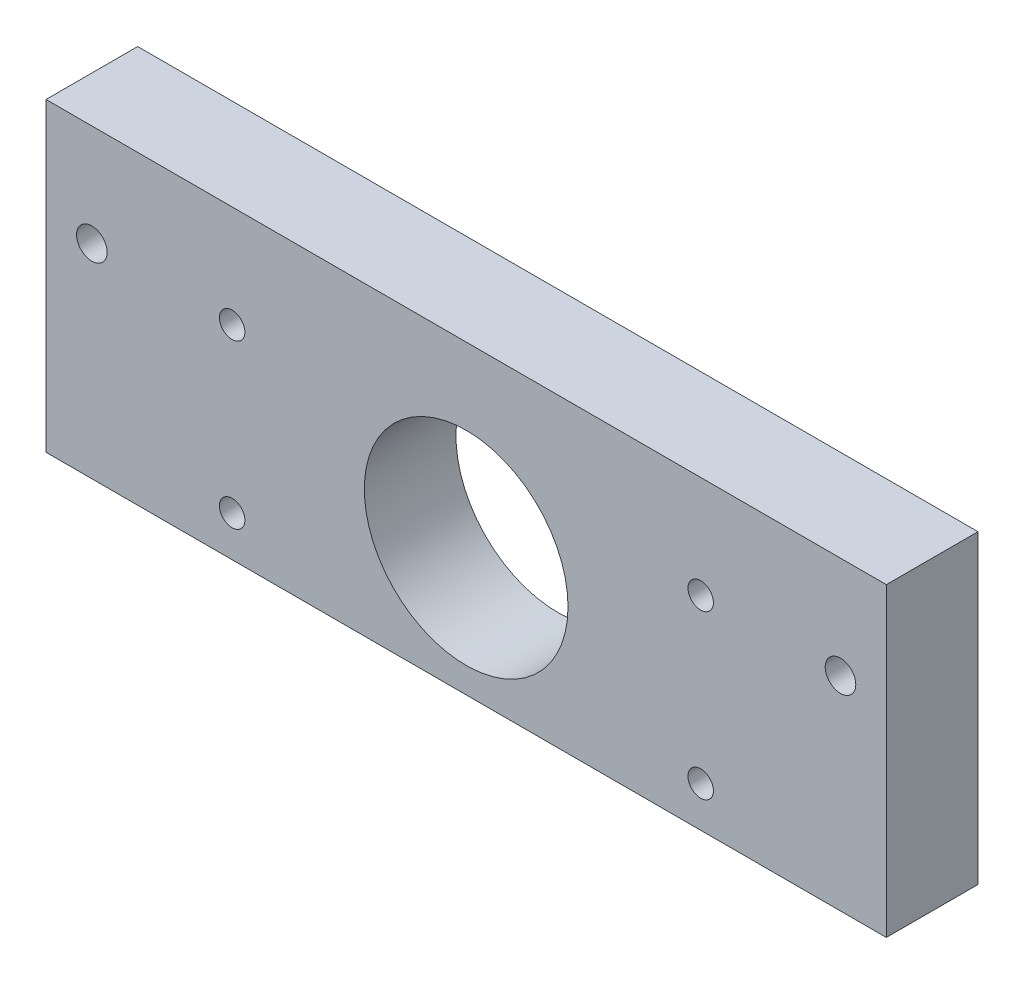
ISO-10303-21;
HEADER;
FILE_DESCRIPTION(('STEP AP214'),'2;1');
FILE_NAME('part.step','',(''),(''),'','','');
FILE_SCHEMA(('AUTOMOTIVE_DESIGN { 1 0 10303 214 1 1 1 1 }'));
ENDSEC;
DATA;
#1=APPLICATION_CONTEXT('core data for automotive mechanical design processes');
#2=APPLICATION_PROTOCOL_DEFINITION('international standard','automotive_design',2000,#1);
#3=PRODUCT_CONTEXT('',#1,'mechanical');
#4=PRODUCT('Part','Part','',(#3));
#5=PRODUCT_RELATED_PRODUCT_CATEGORY('part','',(#4));
#6=PRODUCT_DEFINITION_FORMATION('','',#4);
#7=PRODUCT_DEFINITION_CONTEXT('part definition',#1,'design');
#8=PRODUCT_DEFINITION('design','',#6,#7);
#9=PRODUCT_DEFINITION_SHAPE('','',#8);
#10=(LENGTH_UNIT() NAMED_UNIT(*) SI_UNIT(.MILLI.,.METRE.));
#11=(NAMED_UNIT(*) PLANE_ANGLE_UNIT() SI_UNIT($,.RADIAN.));
#12=(NAMED_UNIT(*) SI_UNIT($,.STERADIAN.) SOLID_ANGLE_UNIT());
#13=UNCERTAINTY_MEASURE_WITH_UNIT(LENGTH_MEASURE(1.E-05),#10,'distance_accuracy_value','');
#14=(GEOMETRIC_REPRESENTATION_CONTEXT(3) GLOBAL_UNCERTAINTY_ASSIGNED_CONTEXT((#13)) GLOBAL_UNIT_ASSIGNED_CONTEXT((#10,
#11,#12)) REPRESENTATION_CONTEXT('',''));
#15=CARTESIAN_POINT('',(0.,0.,0.));
#16=DIRECTION('',(0.,0.,1.));
#17=DIRECTION('',(1.,0.,0.));
#18=AXIS2_PLACEMENT_3D('',#15,#16,#17);
#19=CARTESIAN_POINT('',(82.5,30.,18.));
#20=DIRECTION('',(-1.,0.,0.));
#21=DIRECTION('',(0.,0.,1.));
#22=AXIS2_PLACEMENT_3D('',#19,#20,#21);
#23=PLANE('',#22);
#24=DIRECTION('',(0.,1.,0.));
#25=VECTOR('',#24,1.);
#26=CARTESIAN_POINT('',(82.5,30.,0.));
#27=LINE('',#26,#25);
#28=CARTESIAN_POINT('',(82.5,-30.,0.));
#29=VERTEX_POINT('',#28);
#30=CARTESIAN_POINT('',(82.5,30.,0.));
#31=VERTEX_POINT('',#30);
#32=EDGE_CURVE('E114',#29,#31,#27,.T.);
#33=ORIENTED_EDGE('',*,*,#32,.T.);
#34=DIRECTION('',(0.,0.,-1.));
#35=VECTOR('',#34,1.);
#36=CARTESIAN_POINT('',(82.5,30.,18.));
#37=LINE('',#36,#35);
#38=CARTESIAN_POINT('',(82.5,30.,18.));
#39=VERTEX_POINT('',#38);
#40=EDGE_CURVE('E11',#39,#31,#37,.T.);
#41=ORIENTED_EDGE('',*,*,#40,.F.);
#42=DIRECTION('',(0.,1.,0.));
#43=VECTOR('',#42,1.);
#44=CARTESIAN_POINT('',(82.5,30.,18.));
#45=LINE('',#44,#43);
#46=CARTESIAN_POINT('',(82.5,-30.,18.));
#47=VERTEX_POINT('',#46);
#48=EDGE_CURVE('E117',#47,#39,#45,.T.);
#49=ORIENTED_EDGE('',*,*,#48,.F.);
#50=DIRECTION('',(0.,0.,-1.));
#51=VECTOR('',#50,1.);
#52=CARTESIAN_POINT('',(82.5,-30.,18.));
#53=LINE('',#52,#51);
#54=EDGE_CURVE('E123',#47,#29,#53,.T.);
#55=ORIENTED_EDGE('',*,*,#54,.T.);
#56=EDGE_LOOP('',(#33,#41,#49,#55));
#57=FACE_BOUND('',#56,.T.);
#58=ADVANCED_FACE('F33',(#57),#23,.F.);
#59=CARTESIAN_POINT('',(-82.5,30.,18.));
#60=DIRECTION('',(0.,-1.,0.));
#61=DIRECTION('',(0.,0.,-1.));
#62=AXIS2_PLACEMENT_3D('',#59,#60,#61);
#63=PLANE('',#62);
#64=DIRECTION('',(-1.,0.,0.));
#65=VECTOR('',#64,1.);
#66=CARTESIAN_POINT('',(-82.5,30.,0.));
#67=LINE('',#66,#65);
#68=CARTESIAN_POINT('',(-82.5,30.,0.));
#69=VERTEX_POINT('',#68);
#70=EDGE_CURVE('E126',#31,#69,#67,.T.);
#71=ORIENTED_EDGE('',*,*,#70,.T.);
#72=DIRECTION('',(0.,0.,-1.));
#73=VECTOR('',#72,1.);
#74=CARTESIAN_POINT('',(-82.5,30.,18.));
#75=LINE('',#74,#73);
#76=CARTESIAN_POINT('',(-82.5,30.,18.));
#77=VERTEX_POINT('',#76);
#78=EDGE_CURVE('E41',#77,#69,#75,.T.);
#79=ORIENTED_EDGE('',*,*,#78,.F.);
#80=DIRECTION('',(-1.,0.,0.));
#81=VECTOR('',#80,1.);
#82=CARTESIAN_POINT('',(-82.5,30.,18.));
#83=LINE('',#82,#81);
#84=EDGE_CURVE('E80',#39,#77,#83,.T.);
#85=ORIENTED_EDGE('',*,*,#84,.F.);
#86=ORIENTED_EDGE('',*,*,#40,.T.);
#87=EDGE_LOOP('',(#71,#79,#85,#86));
#88=FACE_BOUND('',#87,.T.);
#89=ADVANCED_FACE('F151',(#88),#63,.F.);
#90=CARTESIAN_POINT('',(-82.5,30.,18.));
#91=DIRECTION('',(1.,0.,0.));
#92=DIRECTION('',(0.,1.,0.));
#93=AXIS2_PLACEMENT_3D('',#90,#91,#92);
#94=PLANE('',#93);
#95=DIRECTION('',(0.,-1.,0.));
#96=VECTOR('',#95,1.);
#97=CARTESIAN_POINT('',(-82.5,30.,0.));
#98=LINE('',#97,#96);
#99=CARTESIAN_POINT('',(-82.5,-30.,0.));
#100=VERTEX_POINT('',#99);
#101=EDGE_CURVE('E67',#69,#100,#98,.T.);
#102=ORIENTED_EDGE('',*,*,#101,.T.);
#103=DIRECTION('',(0.,0.,-1.));
#104=VECTOR('',#103,1.);
#105=CARTESIAN_POINT('',(-82.5,-30.,18.));
#106=LINE('',#105,#104);
#107=CARTESIAN_POINT('',(-82.5,-30.,18.));
#108=VERTEX_POINT('',#107);
#109=EDGE_CURVE('E131',#108,#100,#106,.T.);
#110=ORIENTED_EDGE('',*,*,#109,.F.);
#111=DIRECTION('',(0.,-1.,0.));
#112=VECTOR('',#111,1.);
#113=CARTESIAN_POINT('',(-82.5,30.,18.));
#114=LINE('',#113,#112);
#115=EDGE_CURVE('E120',#77,#108,#114,.T.);
#116=ORIENTED_EDGE('',*,*,#115,.F.);
#117=ORIENTED_EDGE('',*,*,#78,.T.);
#118=EDGE_LOOP('',(#102,#110,#116,#117));
#119=FACE_BOUND('',#118,.T.);
#120=ADVANCED_FACE('F133',(#119),#94,.F.);
#121=CARTESIAN_POINT('',(-82.5,-30.,18.));
#122=DIRECTION('',(0.,1.,0.));
#123=DIRECTION('',(0.,0.,1.));
#124=AXIS2_PLACEMENT_3D('',#121,#122,#123);
#125=PLANE('',#124);
#126=CARTESIAN_POINT('',(-57.5,-30.,9.00000000000004));
#127=DIRECTION('',(0.,-1.,0.));
#128=DIRECTION('',(0.,0.,-1.));
#129=AXIS2_PLACEMENT_3D('',#126,#127,#128);
#130=CIRCLE('',#129,1.99999999999999);
#131=CARTESIAN_POINT('',(-57.5,-30.,7.00000000000004));
#132=VERTEX_POINT('',#131);
#133=EDGE_CURVE('E98',#132,#132,#130,.T.);
#134=ORIENTED_EDGE('',*,*,#133,.F.);
#135=EDGE_LOOP('',(#134));
#136=FACE_BOUND('',#135,.T.);
#137=CARTESIAN_POINT('',(57.5000000000001,-30.,9.00000000000004));
#138=DIRECTION('',(0.,-1.,0.));
#139=DIRECTION('',(0.,0.,-1.));
#140=AXIS2_PLACEMENT_3D('',#137,#138,#139);
#141=CIRCLE('',#140,1.99999999999999);
#142=CARTESIAN_POINT('',(57.5000000000001,-30.,7.00000000000004));
#143=VERTEX_POINT('',#142);
#144=EDGE_CURVE('E97',#143,#143,#141,.T.);
#145=ORIENTED_EDGE('',*,*,#144,.F.);
#146=EDGE_LOOP('',(#145));
#147=FACE_BOUND('',#146,.T.);
#148=DIRECTION('',(1.,0.,0.));
#149=VECTOR('',#148,1.);
#150=CARTESIAN_POINT('',(-82.5,-30.,0.));
#151=LINE('',#150,#149);
#152=EDGE_CURVE('E73',#100,#29,#151,.T.);
#153=ORIENTED_EDGE('',*,*,#152,.T.);
#154=ORIENTED_EDGE('',*,*,#54,.F.);
#155=DIRECTION('',(1.,0.,0.));
#156=VECTOR('',#155,1.);
#157=CARTESIAN_POINT('',(-82.5,-30.,18.));
#158=LINE('',#157,#156);
#159=EDGE_CURVE('E49',#108,#47,#158,.T.);
#160=ORIENTED_EDGE('',*,*,#159,.F.);
#161=ORIENTED_EDGE('',*,*,#109,.T.);
#162=EDGE_LOOP('',(#153,#154,#160,#161));
#163=FACE_BOUND('',#162,.T.);
#164=ADVANCED_FACE('F140',(#136,#147,#163),#125,.F.);
#165=CARTESIAN_POINT('',(0.,0.,18.));
#166=DIRECTION('',(0.,0.,1.));
#167=DIRECTION('',(1.,0.,0.));
#168=AXIS2_PLACEMENT_3D('',#165,#166,#167);
#169=PLANE('',#168);
#170=CARTESIAN_POINT('',(46.0500000000003,9.94999999999987,18.));
#171=DIRECTION('',(0.,0.,-1.));
#172=DIRECTION('',(-1.,0.,0.));
#173=AXIS2_PLACEMENT_3D('',#170,#171,#172);
#174=CIRCLE('',#173,2.5);
#175=CARTESIAN_POINT('',(43.5500000000003,9.94999999999987,18.));
#176=VERTEX_POINT('',#175);
#177=EDGE_CURVE('E314',#176,#176,#174,.T.);
#178=ORIENTED_EDGE('',*,*,#177,.T.);
#179=EDGE_LOOP('',(#178));
#180=FACE_BOUND('',#179,.T.);
#181=CARTESIAN_POINT('',(46.0500000000002,-22.0500000000001,18.));
#182=DIRECTION('',(0.,0.,-1.));
#183=DIRECTION('',(-1.,0.,0.));
#184=AXIS2_PLACEMENT_3D('',#181,#182,#183);
#185=CIRCLE('',#184,2.5);
#186=CARTESIAN_POINT('',(43.5500000000002,-22.0500000000001,18.));
#187=VERTEX_POINT('',#186);
#188=EDGE_CURVE('E324',#187,#187,#185,.T.);
#189=ORIENTED_EDGE('',*,*,#188,.T.);
#190=EDGE_LOOP('',(#189));
#191=FACE_BOUND('',#190,.T.);
#192=CARTESIAN_POINT('',(-45.9499999999996,9.94999999999998,18.));
#193=DIRECTION('',(0.,0.,-1.));
#194=DIRECTION('',(-1.,0.,0.));
#195=AXIS2_PLACEMENT_3D('',#192,#193,#194);
#196=CIRCLE('',#195,2.5);
#197=CARTESIAN_POINT('',(-48.4499999999996,9.94999999999998,18.));
#198=VERTEX_POINT('',#197);
#199=EDGE_CURVE('E330',#198,#198,#196,.T.);
#200=ORIENTED_EDGE('',*,*,#199,.T.);
#201=EDGE_LOOP('',(#200));
#202=FACE_BOUND('',#201,.T.);
#203=CARTESIAN_POINT('',(-45.9499999999996,-22.05,18.));
#204=DIRECTION('',(0.,0.,-1.));
#205=DIRECTION('',(-1.,0.,0.));
#206=AXIS2_PLACEMENT_3D('',#203,#204,#205);
#207=CIRCLE('',#206,2.5);
#208=CARTESIAN_POINT('',(-48.4499999999996,-22.05,18.));
#209=VERTEX_POINT('',#208);
#210=EDGE_CURVE('E336',#209,#209,#207,.T.);
#211=ORIENTED_EDGE('',*,*,#210,.T.);
#212=EDGE_LOOP('',(#211));
#213=FACE_BOUND('',#212,.T.);
#214=CARTESIAN_POINT('',(73.5,9.99999999999999,18.));
#215=DIRECTION('',(0.,0.,1.));
#216=DIRECTION('',(1.,0.,0.));
#217=AXIS2_PLACEMENT_3D('',#214,#215,#216);
#218=CIRCLE('',#217,3.);
#219=CARTESIAN_POINT('',(76.5,9.99999999999999,18.));
#220=VERTEX_POINT('',#219);
#221=EDGE_CURVE('E339',#220,#220,#218,.T.);
#222=ORIENTED_EDGE('',*,*,#221,.F.);
#223=EDGE_LOOP('',(#222));
#224=FACE_BOUND('',#223,.T.);
#225=CARTESIAN_POINT('',(-73.5,9.99999999999999,18.));
#226=DIRECTION('',(0.,0.,1.));
#227=DIRECTION('',(1.,0.,0.));
#228=AXIS2_PLACEMENT_3D('',#225,#226,#227);
#229=CIRCLE('',#228,3.);
#230=CARTESIAN_POINT('',(-70.5,9.99999999999999,18.));
#231=VERTEX_POINT('',#230);
#232=EDGE_CURVE('E345',#231,#231,#229,.T.);
#233=ORIENTED_EDGE('',*,*,#232,.F.);
#234=EDGE_LOOP('',(#233));
#235=FACE_BOUND('',#234,.T.);
#236=CARTESIAN_POINT('',(0.,-5.,18.));
#237=DIRECTION('',(0.,0.,1.));
#238=DIRECTION('',(1.,0.,0.));
#239=AXIS2_PLACEMENT_3D('',#236,#237,#238);
#240=CIRCLE('',#239,20.);
#241=CARTESIAN_POINT('',(20.,-5.,18.));
#242=VERTEX_POINT('',#241);
#243=EDGE_CURVE('E110',#242,#242,#240,.T.);
#244=ORIENTED_EDGE('',*,*,#243,.F.);
#245=EDGE_LOOP('',(#244));
#246=FACE_BOUND('',#245,.T.);
#247=ORIENTED_EDGE('',*,*,#48,.T.);
#248=ORIENTED_EDGE('',*,*,#84,.T.);
#249=ORIENTED_EDGE('',*,*,#115,.T.);
#250=ORIENTED_EDGE('',*,*,#159,.T.);
#251=EDGE_LOOP('',(#247,#248,#249,#250));
#252=FACE_BOUND('',#251,.T.);
#253=ADVANCED_FACE('F142',(#180,#191,#202,#213,#224,#235,#246,#252),#169,.T.);
#254=CARTESIAN_POINT('',(0.,0.,0.));
#255=DIRECTION('',(0.,0.,1.));
#256=DIRECTION('',(1.,0.,0.));
#257=AXIS2_PLACEMENT_3D('',#254,#255,#256);
#258=PLANE('',#257);
#259=CARTESIAN_POINT('',(46.0500000000003,9.94999999999987,0.));
#260=DIRECTION('',(0.,0.,-1.));
#261=DIRECTION('',(-1.,0.,0.));
#262=AXIS2_PLACEMENT_3D('',#259,#260,#261);
#263=CIRCLE('',#262,2.49999999999999);
#264=CARTESIAN_POINT('',(43.5500000000003,9.94999999999987,0.));
#265=VERTEX_POINT('',#264);
#266=EDGE_CURVE('E317',#265,#265,#263,.T.);
#267=ORIENTED_EDGE('',*,*,#266,.F.);
#268=EDGE_LOOP('',(#267));
#269=FACE_BOUND('',#268,.T.);
#270=CARTESIAN_POINT('',(46.0500000000002,-22.0500000000001,0.));
#271=DIRECTION('',(0.,0.,-1.));
#272=DIRECTION('',(-1.,0.,0.));
#273=AXIS2_PLACEMENT_3D('',#270,#271,#272);
#274=CIRCLE('',#273,2.49999999999999);
#275=CARTESIAN_POINT('',(43.5500000000002,-22.0500000000001,0.));
#276=VERTEX_POINT('',#275);
#277=EDGE_CURVE('E319',#276,#276,#274,.T.);
#278=ORIENTED_EDGE('',*,*,#277,.F.);
#279=EDGE_LOOP('',(#278));
#280=FACE_BOUND('',#279,.T.);
#281=CARTESIAN_POINT('',(-45.9499999999996,9.94999999999998,0.));
#282=DIRECTION('',(0.,0.,-1.));
#283=DIRECTION('',(-1.,0.,0.));
#284=AXIS2_PLACEMENT_3D('',#281,#282,#283);
#285=CIRCLE('',#284,2.49999999999999);
#286=CARTESIAN_POINT('',(-48.4499999999996,9.94999999999998,0.));
#287=VERTEX_POINT('',#286);
#288=EDGE_CURVE('E327',#287,#287,#285,.T.);
#289=ORIENTED_EDGE('',*,*,#288,.F.);
#290=EDGE_LOOP('',(#289));
#291=FACE_BOUND('',#290,.T.);
#292=CARTESIAN_POINT('',(-45.9499999999996,-22.05,0.));
#293=DIRECTION('',(0.,0.,-1.));
#294=DIRECTION('',(-1.,0.,0.));
#295=AXIS2_PLACEMENT_3D('',#292,#293,#294);
#296=CIRCLE('',#295,2.49999999999999);
#297=CARTESIAN_POINT('',(-48.4499999999996,-22.05,0.));
#298=VERTEX_POINT('',#297);
#299=EDGE_CURVE('E333',#298,#298,#296,.T.);
#300=ORIENTED_EDGE('',*,*,#299,.F.);
#301=EDGE_LOOP('',(#300));
#302=FACE_BOUND('',#301,.T.);
#303=CARTESIAN_POINT('',(0.,-5.,0.));
#304=DIRECTION('',(0.,0.,1.));
#305=DIRECTION('',(1.,0.,0.));
#306=AXIS2_PLACEMENT_3D('',#303,#304,#305);
#307=CIRCLE('',#306,20.);
#308=CARTESIAN_POINT('',(20.,-5.,0.));
#309=VERTEX_POINT('',#308);
#310=EDGE_CURVE('E111',#309,#309,#307,.T.);
#311=ORIENTED_EDGE('',*,*,#310,.T.);
#312=EDGE_LOOP('',(#311));
#313=FACE_BOUND('',#312,.T.);
#314=ORIENTED_EDGE('',*,*,#32,.F.);
#315=ORIENTED_EDGE('',*,*,#152,.F.);
#316=ORIENTED_EDGE('',*,*,#101,.F.);
#317=ORIENTED_EDGE('',*,*,#70,.F.);
#318=EDGE_LOOP('',(#314,#315,#316,#317));
#319=FACE_BOUND('',#318,.T.);
#320=ADVANCED_FACE('F136',(#269,#280,#291,#302,#313,#319),#258,.F.);
#321=CARTESIAN_POINT('',(0.,-5.,0.));
#322=DIRECTION('',(0.,0.,1.));
#323=DIRECTION('',(1.,0.,0.));
#324=AXIS2_PLACEMENT_3D('',#321,#322,#323);
#325=CYLINDRICAL_SURFACE('',#324,20.);
#326=ORIENTED_EDGE('',*,*,#310,.F.);
#327=EDGE_LOOP('',(#326));
#328=FACE_BOUND('',#327,.T.);
#329=ORIENTED_EDGE('',*,*,#243,.T.);
#330=EDGE_LOOP('',(#329));
#331=FACE_BOUND('',#330,.T.);
#332=ADVANCED_FACE('F172',(#328,#331),#325,.F.);
#333=CARTESIAN_POINT('',(57.5000000000001,0.,9.00000000000004));
#334=DIRECTION('',(0.,-1.,0.));
#335=DIRECTION('',(0.,0.,-1.));
#336=AXIS2_PLACEMENT_3D('',#333,#334,#335);
#337=CONICAL_SURFACE('',#336,1.99999999999999,1.02974425867665);
#338=CARTESIAN_POINT('',(57.5000000000001,1.20172123805512,9.00000000000004));
#339=VERTEX_POINT('',#338);
#340=VERTEX_LOOP('',#339);
#341=FACE_BOUND('',#340,.T.);
#342=CARTESIAN_POINT('',(57.5000000000001,0.,9.00000000000004));
#343=DIRECTION('',(0.,-1.,0.));
#344=DIRECTION('',(0.,0.,-1.));
#345=AXIS2_PLACEMENT_3D('',#342,#343,#344);
#346=CIRCLE('',#345,1.99999999999999);
#347=CARTESIAN_POINT('',(57.5000000000001,0.,7.00000000000005));
#348=VERTEX_POINT('',#347);
#349=EDGE_CURVE('E101',#348,#348,#346,.T.);
#350=ORIENTED_EDGE('',*,*,#349,.T.);
#351=EDGE_LOOP('',(#350));
#352=FACE_BOUND('',#351,.T.);
#353=ADVANCED_FACE('F176',(#341,#352),#337,.F.);
#354=CARTESIAN_POINT('',(57.5000000000001,-30.,9.00000000000004));
#355=DIRECTION('',(0.,-1.,0.));
#356=DIRECTION('',(0.,0.,-1.));
#357=AXIS2_PLACEMENT_3D('',#354,#355,#356);
#358=CYLINDRICAL_SURFACE('',#357,1.99999999999999);
#359=ORIENTED_EDGE('',*,*,#349,.F.);
#360=EDGE_LOOP('',(#359));
#361=FACE_BOUND('',#360,.T.);
#362=ORIENTED_EDGE('',*,*,#144,.T.);
#363=EDGE_LOOP('',(#362));
#364=FACE_BOUND('',#363,.T.);
#365=ADVANCED_FACE('F91',(#361,#364),#358,.F.);
#366=CARTESIAN_POINT('',(-57.5,0.,9.00000000000004));
#367=DIRECTION('',(0.,-1.,0.));
#368=DIRECTION('',(0.,0.,-1.));
#369=AXIS2_PLACEMENT_3D('',#366,#367,#368);
#370=CONICAL_SURFACE('',#369,1.99999999999999,1.02974425867665);
#371=CARTESIAN_POINT('',(-57.5,1.20172123805512,9.00000000000004));
#372=VERTEX_POINT('',#371);
#373=VERTEX_LOOP('',#372);
#374=FACE_BOUND('',#373,.T.);
#375=CARTESIAN_POINT('',(-57.5,0.,9.00000000000004));
#376=DIRECTION('',(0.,-1.,0.));
#377=DIRECTION('',(0.,0.,-1.));
#378=AXIS2_PLACEMENT_3D('',#375,#376,#377);
#379=CIRCLE('',#378,1.99999999999999);
#380=CARTESIAN_POINT('',(-57.5,0.,7.00000000000005));
#381=VERTEX_POINT('',#380);
#382=EDGE_CURVE('E95',#381,#381,#379,.T.);
#383=ORIENTED_EDGE('',*,*,#382,.T.);
#384=EDGE_LOOP('',(#383));
#385=FACE_BOUND('',#384,.T.);
#386=ADVANCED_FACE('F87',(#374,#385),#370,.F.);
#387=CARTESIAN_POINT('',(-57.5,-30.,9.00000000000004));
#388=DIRECTION('',(0.,-1.,0.));
#389=DIRECTION('',(0.,0.,-1.));
#390=AXIS2_PLACEMENT_3D('',#387,#388,#389);
#391=CYLINDRICAL_SURFACE('',#390,1.99999999999999);
#392=ORIENTED_EDGE('',*,*,#382,.F.);
#393=EDGE_LOOP('',(#392));
#394=FACE_BOUND('',#393,.T.);
#395=ORIENTED_EDGE('',*,*,#133,.T.);
#396=EDGE_LOOP('',(#395));
#397=FACE_BOUND('',#396,.T.);
#398=ADVANCED_FACE('F90',(#394,#397),#391,.F.);
#399=CARTESIAN_POINT('',(-73.5,9.99999999999999,4.));
#400=DIRECTION('',(0.,0.,-1.));
#401=DIRECTION('',(-1.,0.,0.));
#402=AXIS2_PLACEMENT_3D('',#399,#400,#401);
#403=PLANE('',#402);
#404=CARTESIAN_POINT('',(-73.5,9.99999999999999,4.));
#405=DIRECTION('',(0.,0.,1.));
#406=DIRECTION('',(1.,0.,0.));
#407=AXIS2_PLACEMENT_3D('',#404,#405,#406);
#408=CIRCLE('',#407,3.);
#409=CARTESIAN_POINT('',(-70.5,9.99999999999999,4.));
#410=VERTEX_POINT('',#409);
#411=EDGE_CURVE('E104',#410,#410,#408,.T.);
#412=ORIENTED_EDGE('',*,*,#411,.T.);
#413=EDGE_LOOP('',(#412));
#414=FACE_BOUND('',#413,.T.);
#415=ADVANCED_FACE('F217',(#414),#403,.F.);
#416=CARTESIAN_POINT('',(-73.5,9.99999999999999,18.));
#417=DIRECTION('',(0.,0.,1.));
#418=DIRECTION('',(1.,0.,0.));
#419=AXIS2_PLACEMENT_3D('',#416,#417,#418);
#420=CYLINDRICAL_SURFACE('',#419,3.);
#421=ORIENTED_EDGE('',*,*,#411,.F.);
#422=EDGE_LOOP('',(#421));
#423=FACE_BOUND('',#422,.T.);
#424=ORIENTED_EDGE('',*,*,#232,.T.);
#425=EDGE_LOOP('',(#424));
#426=FACE_BOUND('',#425,.T.);
#427=ADVANCED_FACE('F226',(#423,#426),#420,.F.);
#428=CARTESIAN_POINT('',(73.5,9.99999999999999,4.));
#429=DIRECTION('',(0.,0.,-1.));
#430=DIRECTION('',(-1.,0.,0.));
#431=AXIS2_PLACEMENT_3D('',#428,#429,#430);
#432=PLANE('',#431);
#433=CARTESIAN_POINT('',(73.5,9.99999999999999,4.));
#434=DIRECTION('',(0.,0.,1.));
#435=DIRECTION('',(1.,0.,0.));
#436=AXIS2_PLACEMENT_3D('',#433,#434,#435);
#437=CIRCLE('',#436,3.);
#438=CARTESIAN_POINT('',(76.5,9.99999999999999,4.));
#439=VERTEX_POINT('',#438);
#440=EDGE_CURVE('E342',#439,#439,#437,.T.);
#441=ORIENTED_EDGE('',*,*,#440,.T.);
#442=EDGE_LOOP('',(#441));
#443=FACE_BOUND('',#442,.T.);
#444=ADVANCED_FACE('F236',(#443),#432,.F.);
#445=CARTESIAN_POINT('',(73.5,9.99999999999999,18.));
#446=DIRECTION('',(0.,0.,1.));
#447=DIRECTION('',(1.,0.,0.));
#448=AXIS2_PLACEMENT_3D('',#445,#446,#447);
#449=CYLINDRICAL_SURFACE('',#448,3.);
#450=ORIENTED_EDGE('',*,*,#440,.F.);
#451=EDGE_LOOP('',(#450));
#452=FACE_BOUND('',#451,.T.);
#453=ORIENTED_EDGE('',*,*,#221,.T.);
#454=EDGE_LOOP('',(#453));
#455=FACE_BOUND('',#454,.T.);
#456=ADVANCED_FACE('F246',(#452,#455),#449,.F.);
#457=CARTESIAN_POINT('',(-45.9499999999996,-22.05,0.));
#458=DIRECTION('',(0.,0.,-1.));
#459=DIRECTION('',(-1.,0.,0.));
#460=AXIS2_PLACEMENT_3D('',#457,#458,#459);
#461=CYLINDRICAL_SURFACE('',#460,2.49999999999999);
#462=ORIENTED_EDGE('',*,*,#210,.F.);
#463=EDGE_LOOP('',(#462));
#464=FACE_BOUND('',#463,.T.);
#465=ORIENTED_EDGE('',*,*,#299,.T.);
#466=EDGE_LOOP('',(#465));
#467=FACE_BOUND('',#466,.T.);
#468=ADVANCED_FACE('F256',(#464,#467),#461,.F.);
#469=CARTESIAN_POINT('',(-45.9499999999996,9.94999999999998,0.));
#470=DIRECTION('',(0.,0.,-1.));
#471=DIRECTION('',(-1.,0.,0.));
#472=AXIS2_PLACEMENT_3D('',#469,#470,#471);
#473=CYLINDRICAL_SURFACE('',#472,2.49999999999999);
#474=ORIENTED_EDGE('',*,*,#199,.F.);
#475=EDGE_LOOP('',(#474));
#476=FACE_BOUND('',#475,.T.);
#477=ORIENTED_EDGE('',*,*,#288,.T.);
#478=EDGE_LOOP('',(#477));
#479=FACE_BOUND('',#478,.T.);
#480=ADVANCED_FACE('F277',(#476,#479),#473,.F.);
#481=CARTESIAN_POINT('',(46.0500000000002,-22.0500000000001,0.));
#482=DIRECTION('',(0.,0.,-1.));
#483=DIRECTION('',(-1.,0.,0.));
#484=AXIS2_PLACEMENT_3D('',#481,#482,#483);
#485=CYLINDRICAL_SURFACE('',#484,2.49999999999999);
#486=ORIENTED_EDGE('',*,*,#188,.F.);
#487=EDGE_LOOP('',(#486));
#488=FACE_BOUND('',#487,.T.);
#489=ORIENTED_EDGE('',*,*,#277,.T.);
#490=EDGE_LOOP('',(#489));
#491=FACE_BOUND('',#490,.T.);
#492=ADVANCED_FACE('F287',(#488,#491),#485,.F.);
#493=CARTESIAN_POINT('',(46.0500000000003,9.94999999999987,0.));
#494=DIRECTION('',(0.,0.,-1.));
#495=DIRECTION('',(-1.,0.,0.));
#496=AXIS2_PLACEMENT_3D('',#493,#494,#495);
#497=CYLINDRICAL_SURFACE('',#496,2.49999999999999);
#498=ORIENTED_EDGE('',*,*,#177,.F.);
#499=EDGE_LOOP('',(#498));
#500=FACE_BOUND('',#499,.T.);
#501=ORIENTED_EDGE('',*,*,#266,.T.);
#502=EDGE_LOOP('',(#501));
#503=FACE_BOUND('',#502,.T.);
#504=ADVANCED_FACE('F297',(#500,#503),#497,.F.);
#505=CLOSED_SHELL('',(#58,#89,#120,#164,#253,#320,#332,#353,#365,#386,#398,#415,#427,#444,#456,
#468,#480,#492,#504));
#506=MANIFOLD_SOLID_BREP('B2',#505);
#507=ADVANCED_BREP_SHAPE_REPRESENTATION('',(#18,#506),#14);
#508=SHAPE_DEFINITION_REPRESENTATION(#9,#507);
ENDSEC;
END-ISO-10303-21;
